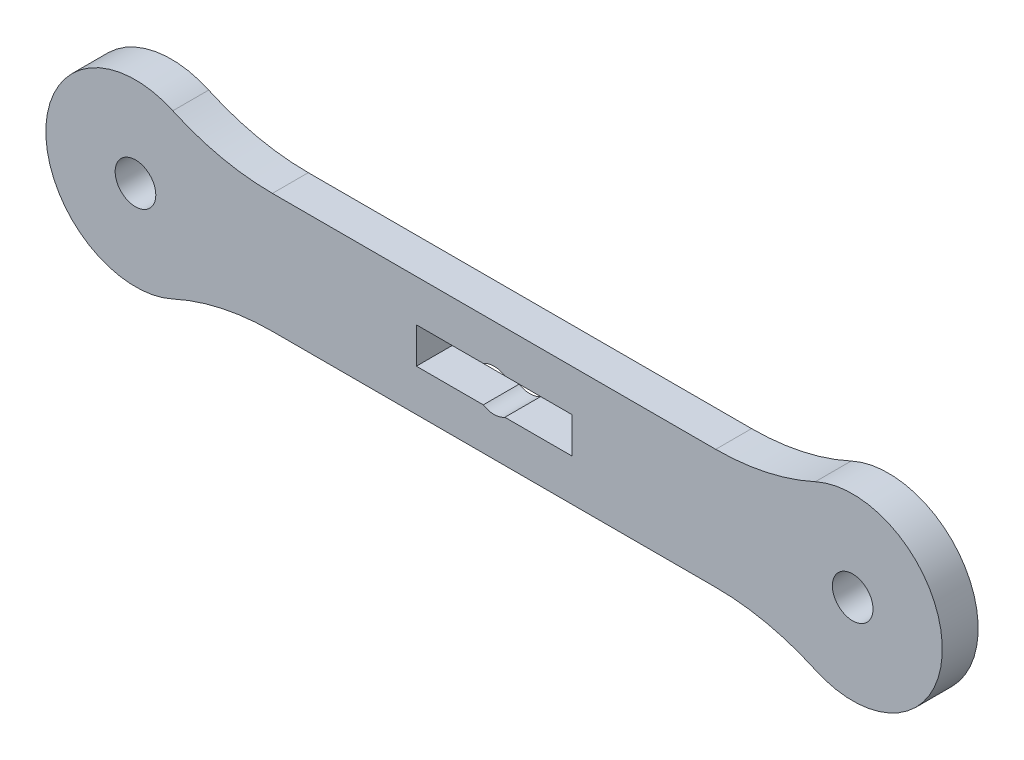
ISO-10303-21;
HEADER;
FILE_DESCRIPTION(('STEP AP214'),'2;1');
FILE_NAME('part.step','',(''),(''),'','','');
FILE_SCHEMA(('AUTOMOTIVE_DESIGN { 1 0 10303 214 1 1 1 1 }'));
ENDSEC;
DATA;
#1=APPLICATION_CONTEXT('core data for automotive mechanical design processes');
#2=APPLICATION_PROTOCOL_DEFINITION('international standard','automotive_design',2000,#1);
#3=PRODUCT_CONTEXT('',#1,'mechanical');
#4=PRODUCT('Part','Part','',(#3));
#5=PRODUCT_RELATED_PRODUCT_CATEGORY('part','',(#4));
#6=PRODUCT_DEFINITION_FORMATION('','',#4);
#7=PRODUCT_DEFINITION_CONTEXT('part definition',#1,'design');
#8=PRODUCT_DEFINITION('design','',#6,#7);
#9=PRODUCT_DEFINITION_SHAPE('','',#8);
#10=(LENGTH_UNIT() NAMED_UNIT(*) SI_UNIT(.MILLI.,.METRE.));
#11=(NAMED_UNIT(*) PLANE_ANGLE_UNIT() SI_UNIT($,.RADIAN.));
#12=(NAMED_UNIT(*) SI_UNIT($,.STERADIAN.) SOLID_ANGLE_UNIT());
#13=UNCERTAINTY_MEASURE_WITH_UNIT(LENGTH_MEASURE(1.E-05),#10,'distance_accuracy_value','');
#14=(GEOMETRIC_REPRESENTATION_CONTEXT(3) GLOBAL_UNCERTAINTY_ASSIGNED_CONTEXT((#13)) GLOBAL_UNIT_ASSIGNED_CONTEXT((#10,
#11,#12)) REPRESENTATION_CONTEXT('',''));
#15=CARTESIAN_POINT('',(0.,0.,0.));
#16=DIRECTION('',(0.,0.,1.));
#17=DIRECTION('',(1.,0.,0.));
#18=AXIS2_PLACEMENT_3D('',#15,#16,#17);
#19=CARTESIAN_POINT('',(30.,0.,3.));
#20=DIRECTION('',(0.,0.,-1.));
#21=DIRECTION('',(-1.,0.,0.));
#22=AXIS2_PLACEMENT_3D('',#19,#20,#21);
#23=CYLINDRICAL_SURFACE('',#22,1.75);
#24=CARTESIAN_POINT('',(30.,0.,0.));
#25=DIRECTION('',(0.,0.,1.));
#26=DIRECTION('',(1.,0.,0.));
#27=AXIS2_PLACEMENT_3D('',#24,#25,#26);
#28=CIRCLE('',#27,1.75);
#29=CARTESIAN_POINT('',(30.901387818866,1.50000000000001,0.));
#30=VERTEX_POINT('',#29);
#31=CARTESIAN_POINT('',(29.098612181134,1.50000000000001,0.));
#32=VERTEX_POINT('',#31);
#33=EDGE_CURVE('E154',#30,#32,#28,.T.);
#34=ORIENTED_EDGE('',*,*,#33,.F.);
#35=DIRECTION('',(0.,0.,-1.));
#36=VECTOR('',#35,1.);
#37=CARTESIAN_POINT('',(30.901387818866,1.50000000000001,3.));
#38=LINE('',#37,#36);
#39=CARTESIAN_POINT('',(30.901387818866,1.50000000000001,3.));
#40=VERTEX_POINT('',#39);
#41=EDGE_CURVE('E149',#40,#30,#38,.T.);
#42=ORIENTED_EDGE('',*,*,#41,.F.);
#43=CARTESIAN_POINT('',(30.,0.,3.));
#44=DIRECTION('',(0.,0.,1.));
#45=DIRECTION('',(1.,0.,0.));
#46=AXIS2_PLACEMENT_3D('',#43,#44,#45);
#47=CIRCLE('',#46,1.75);
#48=CARTESIAN_POINT('',(29.098612181134,1.50000000000001,3.));
#49=VERTEX_POINT('',#48);
#50=EDGE_CURVE('E152',#40,#49,#47,.T.);
#51=ORIENTED_EDGE('',*,*,#50,.T.);
#52=DIRECTION('',(0.,0.,-1.));
#53=VECTOR('',#52,1.);
#54=CARTESIAN_POINT('',(29.098612181134,1.50000000000001,3.));
#55=LINE('',#54,#53);
#56=EDGE_CURVE('E199',#49,#32,#55,.T.);
#57=ORIENTED_EDGE('',*,*,#56,.T.);
#58=EDGE_LOOP('',(#34,#42,#51,#57));
#59=FACE_BOUND('',#58,.T.);
#60=ADVANCED_FACE('F35',(#59),#23,.F.);
#61=CARTESIAN_POINT('',(0.,1.50000000000002,3.));
#62=DIRECTION('',(0.,1.,0.));
#63=DIRECTION('',(-1.,0.,0.));
#64=AXIS2_PLACEMENT_3D('',#61,#62,#63);
#65=PLANE('',#64);
#66=DIRECTION('',(1.,0.,0.));
#67=VECTOR('',#66,1.);
#68=CARTESIAN_POINT('',(0.,1.50000000000002,0.));
#69=LINE('',#68,#67);
#70=CARTESIAN_POINT('',(36.5,1.50000000000001,0.));
#71=VERTEX_POINT('',#70);
#72=EDGE_CURVE('E216',#30,#71,#69,.T.);
#73=ORIENTED_EDGE('',*,*,#72,.T.);
#74=DIRECTION('',(0.,0.,-1.));
#75=VECTOR('',#74,1.);
#76=CARTESIAN_POINT('',(36.5,1.50000000000001,3.));
#77=LINE('',#76,#75);
#78=CARTESIAN_POINT('',(36.5,1.50000000000001,3.));
#79=VERTEX_POINT('',#78);
#80=EDGE_CURVE('E159',#79,#71,#77,.T.);
#81=ORIENTED_EDGE('',*,*,#80,.F.);
#82=DIRECTION('',(1.,0.,0.));
#83=VECTOR('',#82,1.);
#84=CARTESIAN_POINT('',(0.,1.50000000000002,3.));
#85=LINE('',#84,#83);
#86=EDGE_CURVE('E163',#40,#79,#85,.T.);
#87=ORIENTED_EDGE('',*,*,#86,.F.);
#88=ORIENTED_EDGE('',*,*,#41,.T.);
#89=EDGE_LOOP('',(#73,#81,#87,#88));
#90=FACE_BOUND('',#89,.T.);
#91=ADVANCED_FACE('F164',(#90),#65,.F.);
#92=CARTESIAN_POINT('',(36.5,0.,3.));
#93=DIRECTION('',(1.,0.,0.));
#94=DIRECTION('',(0.,0.,-1.));
#95=AXIS2_PLACEMENT_3D('',#92,#93,#94);
#96=PLANE('',#95);
#97=DIRECTION('',(0.,-1.,0.));
#98=VECTOR('',#97,1.);
#99=CARTESIAN_POINT('',(36.5,0.,0.));
#100=LINE('',#99,#98);
#101=CARTESIAN_POINT('',(36.5,-1.49999999999999,0.));
#102=VERTEX_POINT('',#101);
#103=EDGE_CURVE('E218',#71,#102,#100,.T.);
#104=ORIENTED_EDGE('',*,*,#103,.T.);
#105=DIRECTION('',(0.,0.,-1.));
#106=VECTOR('',#105,1.);
#107=CARTESIAN_POINT('',(36.5,-1.49999999999999,3.));
#108=LINE('',#107,#106);
#109=CARTESIAN_POINT('',(36.5,-1.49999999999999,3.));
#110=VERTEX_POINT('',#109);
#111=EDGE_CURVE('E249',#110,#102,#108,.T.);
#112=ORIENTED_EDGE('',*,*,#111,.F.);
#113=DIRECTION('',(0.,-1.,0.));
#114=VECTOR('',#113,1.);
#115=CARTESIAN_POINT('',(36.5,0.,3.));
#116=LINE('',#115,#114);
#117=EDGE_CURVE('E167',#79,#110,#116,.T.);
#118=ORIENTED_EDGE('',*,*,#117,.F.);
#119=ORIENTED_EDGE('',*,*,#80,.T.);
#120=EDGE_LOOP('',(#104,#112,#118,#119));
#121=FACE_BOUND('',#120,.T.);
#122=ADVANCED_FACE('F334',(#121),#96,.F.);
#123=CARTESIAN_POINT('',(0.,-1.49999999999998,3.));
#124=DIRECTION('',(0.,1.,0.));
#125=DIRECTION('',(-1.,0.,0.));
#126=AXIS2_PLACEMENT_3D('',#123,#124,#125);
#127=PLANE('',#126);
#128=DIRECTION('',(1.,0.,0.));
#129=VECTOR('',#128,1.);
#130=CARTESIAN_POINT('',(0.,-1.49999999999998,0.));
#131=LINE('',#130,#129);
#132=CARTESIAN_POINT('',(30.901387818866,-1.49999999999999,0.));
#133=VERTEX_POINT('',#132);
#134=EDGE_CURVE('E221',#133,#102,#131,.T.);
#135=ORIENTED_EDGE('',*,*,#134,.F.);
#136=DIRECTION('',(0.,0.,-1.));
#137=VECTOR('',#136,1.);
#138=CARTESIAN_POINT('',(30.901387818866,-1.49999999999999,3.));
#139=LINE('',#138,#137);
#140=CARTESIAN_POINT('',(30.901387818866,-1.49999999999999,3.));
#141=VERTEX_POINT('',#140);
#142=EDGE_CURVE('E247',#141,#133,#139,.T.);
#143=ORIENTED_EDGE('',*,*,#142,.F.);
#144=DIRECTION('',(1.,0.,0.));
#145=VECTOR('',#144,1.);
#146=CARTESIAN_POINT('',(0.,-1.49999999999998,3.));
#147=LINE('',#146,#145);
#148=EDGE_CURVE('E183',#141,#110,#147,.T.);
#149=ORIENTED_EDGE('',*,*,#148,.T.);
#150=ORIENTED_EDGE('',*,*,#111,.T.);
#151=EDGE_LOOP('',(#135,#143,#149,#150));
#152=FACE_BOUND('',#151,.T.);
#153=ADVANCED_FACE('F369',(#152),#127,.T.);
#154=CARTESIAN_POINT('',(30.,0.,3.));
#155=DIRECTION('',(0.,0.,-1.));
#156=DIRECTION('',(-1.,0.,0.));
#157=AXIS2_PLACEMENT_3D('',#154,#155,#156);
#158=CYLINDRICAL_SURFACE('',#157,1.75);
#159=CARTESIAN_POINT('',(30.,0.,0.));
#160=DIRECTION('',(0.,0.,1.));
#161=DIRECTION('',(1.,0.,0.));
#162=AXIS2_PLACEMENT_3D('',#159,#160,#161);
#163=CIRCLE('',#162,1.75);
#164=CARTESIAN_POINT('',(29.098612181134,-1.49999999999999,0.));
#165=VERTEX_POINT('',#164);
#166=EDGE_CURVE('E224',#165,#133,#163,.T.);
#167=ORIENTED_EDGE('',*,*,#166,.F.);
#168=DIRECTION('',(0.,0.,-1.));
#169=VECTOR('',#168,1.);
#170=CARTESIAN_POINT('',(29.098612181134,-1.49999999999999,3.));
#171=LINE('',#170,#169);
#172=CARTESIAN_POINT('',(29.098612181134,-1.49999999999999,3.));
#173=VERTEX_POINT('',#172);
#174=EDGE_CURVE('E245',#173,#165,#171,.T.);
#175=ORIENTED_EDGE('',*,*,#174,.F.);
#176=CARTESIAN_POINT('',(30.,0.,3.));
#177=DIRECTION('',(0.,0.,1.));
#178=DIRECTION('',(1.,0.,0.));
#179=AXIS2_PLACEMENT_3D('',#176,#177,#178);
#180=CIRCLE('',#179,1.75);
#181=EDGE_CURVE('E186',#173,#141,#180,.T.);
#182=ORIENTED_EDGE('',*,*,#181,.T.);
#183=ORIENTED_EDGE('',*,*,#142,.T.);
#184=EDGE_LOOP('',(#167,#175,#182,#183));
#185=FACE_BOUND('',#184,.T.);
#186=ADVANCED_FACE('F360',(#185),#158,.F.);
#187=CARTESIAN_POINT('',(0.,-1.5,3.));
#188=DIRECTION('',(0.,1.,0.));
#189=DIRECTION('',(-1.,0.,0.));
#190=AXIS2_PLACEMENT_3D('',#187,#188,#189);
#191=PLANE('',#190);
#192=DIRECTION('',(1.,0.,0.));
#193=VECTOR('',#192,1.);
#194=CARTESIAN_POINT('',(0.,-1.5,0.));
#195=LINE('',#194,#193);
#196=CARTESIAN_POINT('',(23.5,-1.49999999999999,0.));
#197=VERTEX_POINT('',#196);
#198=EDGE_CURVE('E227',#197,#165,#195,.T.);
#199=ORIENTED_EDGE('',*,*,#198,.F.);
#200=DIRECTION('',(0.,0.,-1.));
#201=VECTOR('',#200,1.);
#202=CARTESIAN_POINT('',(23.5,-1.49999999999999,3.));
#203=LINE('',#202,#201);
#204=CARTESIAN_POINT('',(23.5,-1.49999999999999,3.));
#205=VERTEX_POINT('',#204);
#206=EDGE_CURVE('E243',#205,#197,#203,.T.);
#207=ORIENTED_EDGE('',*,*,#206,.F.);
#208=DIRECTION('',(1.,0.,0.));
#209=VECTOR('',#208,1.);
#210=CARTESIAN_POINT('',(0.,-1.5,3.));
#211=LINE('',#210,#209);
#212=EDGE_CURVE('E189',#205,#173,#211,.T.);
#213=ORIENTED_EDGE('',*,*,#212,.T.);
#214=ORIENTED_EDGE('',*,*,#174,.T.);
#215=EDGE_LOOP('',(#199,#207,#213,#214));
#216=FACE_BOUND('',#215,.T.);
#217=ADVANCED_FACE('F354',(#216),#191,.T.);
#218=CARTESIAN_POINT('',(23.5,0.,3.));
#219=DIRECTION('',(1.,0.,0.));
#220=DIRECTION('',(0.,0.,-1.));
#221=AXIS2_PLACEMENT_3D('',#218,#219,#220);
#222=PLANE('',#221);
#223=DIRECTION('',(0.,-1.,0.));
#224=VECTOR('',#223,1.);
#225=CARTESIAN_POINT('',(23.5,0.,0.));
#226=LINE('',#225,#224);
#227=CARTESIAN_POINT('',(23.5,1.50000000000001,0.));
#228=VERTEX_POINT('',#227);
#229=EDGE_CURVE('E230',#228,#197,#226,.T.);
#230=ORIENTED_EDGE('',*,*,#229,.F.);
#231=DIRECTION('',(0.,0.,-1.));
#232=VECTOR('',#231,1.);
#233=CARTESIAN_POINT('',(23.5,1.50000000000001,3.));
#234=LINE('',#233,#232);
#235=CARTESIAN_POINT('',(23.5,1.50000000000001,3.));
#236=VERTEX_POINT('',#235);
#237=EDGE_CURVE('E241',#236,#228,#234,.T.);
#238=ORIENTED_EDGE('',*,*,#237,.F.);
#239=DIRECTION('',(0.,-1.,0.));
#240=VECTOR('',#239,1.);
#241=CARTESIAN_POINT('',(23.5,0.,3.));
#242=LINE('',#241,#240);
#243=EDGE_CURVE('E192',#236,#205,#242,.T.);
#244=ORIENTED_EDGE('',*,*,#243,.T.);
#245=ORIENTED_EDGE('',*,*,#206,.T.);
#246=EDGE_LOOP('',(#230,#238,#244,#245));
#247=FACE_BOUND('',#246,.T.);
#248=ADVANCED_FACE('F350',(#247),#222,.T.);
#249=CARTESIAN_POINT('',(60.,0.,3.));
#250=DIRECTION('',(0.,0.,-1.));
#251=DIRECTION('',(-1.,0.,0.));
#252=AXIS2_PLACEMENT_3D('',#249,#250,#251);
#253=CYLINDRICAL_SURFACE('',#252,7.5);
#254=CARTESIAN_POINT('',(60.,0.,3.));
#255=DIRECTION('',(0.,0.,1.));
#256=DIRECTION('',(1.,0.,0.));
#257=AXIS2_PLACEMENT_3D('',#254,#255,#256);
#258=CIRCLE('',#257,7.5);
#259=CARTESIAN_POINT('',(56.875516571621,6.81818181818182,3.));
#260=VERTEX_POINT('',#259);
#261=CARTESIAN_POINT('',(56.875516571621,-6.81818181818181,3.));
#262=VERTEX_POINT('',#261);
#263=EDGE_CURVE('E239',#260,#262,#258,.F.);
#264=ORIENTED_EDGE('',*,*,#263,.T.);
#265=DIRECTION('',(0.,0.,-1.));
#266=VECTOR('',#265,1.);
#267=CARTESIAN_POINT('',(56.875516571621,-6.81818181818181,3.));
#268=LINE('',#267,#266);
#269=CARTESIAN_POINT('',(56.875516571621,-6.81818181818181,0.));
#270=VERTEX_POINT('',#269);
#271=EDGE_CURVE('E263',#262,#270,#268,.T.);
#272=ORIENTED_EDGE('',*,*,#271,.T.);
#273=CARTESIAN_POINT('',(60.,0.,0.));
#274=DIRECTION('',(0.,0.,1.));
#275=DIRECTION('',(1.,0.,0.));
#276=AXIS2_PLACEMENT_3D('',#273,#274,#275);
#277=CIRCLE('',#276,7.5);
#278=CARTESIAN_POINT('',(56.875516571621,6.81818181818182,0.));
#279=VERTEX_POINT('',#278);
#280=EDGE_CURVE('E200',#279,#270,#277,.F.);
#281=ORIENTED_EDGE('',*,*,#280,.F.);
#282=DIRECTION('',(0.,0.,-1.));
#283=VECTOR('',#282,1.);
#284=CARTESIAN_POINT('',(56.875516571621,6.81818181818182,3.));
#285=LINE('',#284,#283);
#286=EDGE_CURVE('E261',#279,#260,#285,.F.);
#287=ORIENTED_EDGE('',*,*,#286,.T.);
#288=EDGE_LOOP('',(#264,#272,#281,#287));
#289=FACE_BOUND('',#288,.T.);
#290=ADVANCED_FACE('F305',(#289),#253,.T.);
#291=CARTESIAN_POINT('',(0.,4.99999999999999,3.));
#292=DIRECTION('',(0.,1.,0.));
#293=DIRECTION('',(-1.,0.,0.));
#294=AXIS2_PLACEMENT_3D('',#291,#292,#293);
#295=PLANE('',#294);
#296=DIRECTION('',(1.,0.,0.));
#297=VECTOR('',#296,1.);
#298=CARTESIAN_POINT('',(0.,4.99999999999999,3.));
#299=LINE('',#298,#297);
#300=CARTESIAN_POINT('',(11.4564392373896,4.99999999999999,3.));
#301=VERTEX_POINT('',#300);
#302=CARTESIAN_POINT('',(48.5435607626104,5.,3.));
#303=VERTEX_POINT('',#302);
#304=EDGE_CURVE('E294',#301,#303,#299,.T.);
#305=ORIENTED_EDGE('',*,*,#304,.T.);
#306=DIRECTION('',(0.,0.,1.));
#307=VECTOR('',#306,1.);
#308=CARTESIAN_POINT('',(48.5435607626104,5.,0.));
#309=LINE('',#308,#307);
#310=CARTESIAN_POINT('',(48.5435607626104,5.,0.));
#311=VERTEX_POINT('',#310);
#312=EDGE_CURVE('E267',#303,#311,#309,.F.);
#313=ORIENTED_EDGE('',*,*,#312,.T.);
#314=DIRECTION('',(1.,0.,0.));
#315=VECTOR('',#314,1.);
#316=CARTESIAN_POINT('',(0.,4.99999999999999,0.));
#317=LINE('',#316,#315);
#318=CARTESIAN_POINT('',(11.4564392373896,4.99999999999999,0.));
#319=VERTEX_POINT('',#318);
#320=EDGE_CURVE('E203',#319,#311,#317,.T.);
#321=ORIENTED_EDGE('',*,*,#320,.F.);
#322=DIRECTION('',(0.,0.,-1.));
#323=VECTOR('',#322,1.);
#324=CARTESIAN_POINT('',(11.4564392373896,4.99999999999999,3.));
#325=LINE('',#324,#323);
#326=EDGE_CURVE('E57',#319,#301,#325,.F.);
#327=ORIENTED_EDGE('',*,*,#326,.T.);
#328=EDGE_LOOP('',(#305,#313,#321,#327));
#329=FACE_BOUND('',#328,.T.);
#330=ADVANCED_FACE('F286',(#329),#295,.T.);
#331=CARTESIAN_POINT('',(0.,0.,3.));
#332=DIRECTION('',(0.,0.,-1.));
#333=DIRECTION('',(-1.,0.,0.));
#334=AXIS2_PLACEMENT_3D('',#331,#332,#333);
#335=CYLINDRICAL_SURFACE('',#334,7.5);
#336=CARTESIAN_POINT('',(0.,0.,0.));
#337=DIRECTION('',(0.,0.,1.));
#338=DIRECTION('',(1.,0.,0.));
#339=AXIS2_PLACEMENT_3D('',#336,#337,#338);
#340=CIRCLE('',#339,7.5);
#341=CARTESIAN_POINT('',(3.12448342837898,6.81818181818182,0.));
#342=VERTEX_POINT('',#341);
#343=CARTESIAN_POINT('',(3.12448342837898,-6.81818181818182,0.));
#344=VERTEX_POINT('',#343);
#345=EDGE_CURVE('E206',#342,#344,#340,.T.);
#346=ORIENTED_EDGE('',*,*,#345,.T.);
#347=DIRECTION('',(0.,0.,-1.));
#348=VECTOR('',#347,1.);
#349=CARTESIAN_POINT('',(3.12448342837898,-6.81818181818182,3.));
#350=LINE('',#349,#348);
#351=CARTESIAN_POINT('',(3.12448342837898,-6.81818181818182,3.));
#352=VERTEX_POINT('',#351);
#353=EDGE_CURVE('E259',#344,#352,#350,.F.);
#354=ORIENTED_EDGE('',*,*,#353,.T.);
#355=CARTESIAN_POINT('',(0.,0.,3.));
#356=DIRECTION('',(0.,0.,1.));
#357=DIRECTION('',(1.,0.,0.));
#358=AXIS2_PLACEMENT_3D('',#355,#356,#357);
#359=CIRCLE('',#358,7.5);
#360=CARTESIAN_POINT('',(3.12448342837898,6.81818181818182,3.));
#361=VERTEX_POINT('',#360);
#362=EDGE_CURVE('E292',#361,#352,#359,.T.);
#363=ORIENTED_EDGE('',*,*,#362,.F.);
#364=DIRECTION('',(0.,0.,-1.));
#365=VECTOR('',#364,1.);
#366=CARTESIAN_POINT('',(3.12448342837898,6.81818181818182,3.));
#367=LINE('',#366,#365);
#368=EDGE_CURVE('E256',#361,#342,#367,.T.);
#369=ORIENTED_EDGE('',*,*,#368,.T.);
#370=EDGE_LOOP('',(#346,#354,#363,#369));
#371=FACE_BOUND('',#370,.T.);
#372=ADVANCED_FACE('F296',(#371),#335,.T.);
#373=CARTESIAN_POINT('',(0.,1.5,3.));
#374=DIRECTION('',(0.,1.,0.));
#375=DIRECTION('',(-1.,0.,0.));
#376=AXIS2_PLACEMENT_3D('',#373,#374,#375);
#377=PLANE('',#376);
#378=DIRECTION('',(1.,0.,0.));
#379=VECTOR('',#378,1.);
#380=CARTESIAN_POINT('',(0.,1.5,0.));
#381=LINE('',#380,#379);
#382=EDGE_CURVE('E233',#228,#32,#381,.T.);
#383=ORIENTED_EDGE('',*,*,#382,.T.);
#384=ORIENTED_EDGE('',*,*,#56,.F.);
#385=DIRECTION('',(1.,0.,0.));
#386=VECTOR('',#385,1.);
#387=CARTESIAN_POINT('',(0.,1.5,3.));
#388=LINE('',#387,#386);
#389=EDGE_CURVE('E173',#236,#49,#388,.T.);
#390=ORIENTED_EDGE('',*,*,#389,.F.);
#391=ORIENTED_EDGE('',*,*,#237,.T.);
#392=EDGE_LOOP('',(#383,#384,#390,#391));
#393=FACE_BOUND('',#392,.T.);
#394=ADVANCED_FACE('F341',(#393),#377,.F.);
#395=CARTESIAN_POINT('',(0.,0.,3.));
#396=DIRECTION('',(0.,0.,-1.));
#397=DIRECTION('',(-1.,0.,0.));
#398=AXIS2_PLACEMENT_3D('',#395,#396,#397);
#399=CYLINDRICAL_SURFACE('',#398,1.7);
#400=CARTESIAN_POINT('',(0.,0.,3.));
#401=DIRECTION('',(0.,0.,1.));
#402=DIRECTION('',(1.,0.,0.));
#403=AXIS2_PLACEMENT_3D('',#400,#401,#402);
#404=CIRCLE('',#403,1.7);
#405=CARTESIAN_POINT('',(1.7,0.,3.));
#406=VERTEX_POINT('',#405);
#407=EDGE_CURVE('E175',#406,#406,#404,.T.);
#408=ORIENTED_EDGE('',*,*,#407,.T.);
#409=EDGE_LOOP('',(#408));
#410=FACE_BOUND('',#409,.T.);
#411=CARTESIAN_POINT('',(0.,0.,0.));
#412=DIRECTION('',(0.,0.,1.));
#413=DIRECTION('',(1.,0.,0.));
#414=AXIS2_PLACEMENT_3D('',#411,#412,#413);
#415=CIRCLE('',#414,1.7);
#416=CARTESIAN_POINT('',(1.7,0.,0.));
#417=VERTEX_POINT('',#416);
#418=EDGE_CURVE('E212',#417,#417,#415,.T.);
#419=ORIENTED_EDGE('',*,*,#418,.F.);
#420=EDGE_LOOP('',(#419));
#421=FACE_BOUND('',#420,.T.);
#422=ADVANCED_FACE('F338',(#410,#421),#399,.F.);
#423=CARTESIAN_POINT('',(0.,-5.00000000000001,3.));
#424=DIRECTION('',(0.,1.,0.));
#425=DIRECTION('',(-1.,0.,0.));
#426=AXIS2_PLACEMENT_3D('',#423,#424,#425);
#427=PLANE('',#426);
#428=DIRECTION('',(1.,0.,0.));
#429=VECTOR('',#428,1.);
#430=CARTESIAN_POINT('',(0.,-5.00000000000001,3.));
#431=LINE('',#430,#429);
#432=CARTESIAN_POINT('',(11.4564392373896,-5.00000000000001,3.));
#433=VERTEX_POINT('',#432);
#434=CARTESIAN_POINT('',(48.5435607626104,-5.,3.));
#435=VERTEX_POINT('',#434);
#436=EDGE_CURVE('E178',#433,#435,#431,.T.);
#437=ORIENTED_EDGE('',*,*,#436,.F.);
#438=DIRECTION('',(0.,0.,1.));
#439=VECTOR('',#438,1.);
#440=CARTESIAN_POINT('',(11.4564392373896,-5.00000000000001,0.));
#441=LINE('',#440,#439);
#442=CARTESIAN_POINT('',(11.4564392373896,-5.00000000000001,0.));
#443=VERTEX_POINT('',#442);
#444=EDGE_CURVE('E253',#433,#443,#441,.F.);
#445=ORIENTED_EDGE('',*,*,#444,.T.);
#446=DIRECTION('',(1.,0.,0.));
#447=VECTOR('',#446,1.);
#448=CARTESIAN_POINT('',(0.,-5.00000000000001,0.));
#449=LINE('',#448,#447);
#450=CARTESIAN_POINT('',(48.5435607626104,-5.,0.));
#451=VERTEX_POINT('',#450);
#452=EDGE_CURVE('E209',#443,#451,#449,.T.);
#453=ORIENTED_EDGE('',*,*,#452,.T.);
#454=DIRECTION('',(0.,0.,-1.));
#455=VECTOR('',#454,1.);
#456=CARTESIAN_POINT('',(48.5435607626104,-5.,3.));
#457=LINE('',#456,#455);
#458=EDGE_CURVE('E158',#451,#435,#457,.F.);
#459=ORIENTED_EDGE('',*,*,#458,.T.);
#460=EDGE_LOOP('',(#437,#445,#453,#459));
#461=FACE_BOUND('',#460,.T.);
#462=ADVANCED_FACE('F315',(#461),#427,.F.);
#463=CARTESIAN_POINT('',(60.,0.,3.));
#464=DIRECTION('',(0.,0.,-1.));
#465=DIRECTION('',(-1.,0.,0.));
#466=AXIS2_PLACEMENT_3D('',#463,#464,#465);
#467=CYLINDRICAL_SURFACE('',#466,1.7);
#468=CARTESIAN_POINT('',(60.,0.,3.));
#469=DIRECTION('',(0.,0.,1.));
#470=DIRECTION('',(1.,0.,0.));
#471=AXIS2_PLACEMENT_3D('',#468,#469,#470);
#472=CIRCLE('',#471,1.7);
#473=CARTESIAN_POINT('',(61.7,0.,3.));
#474=VERTEX_POINT('',#473);
#475=EDGE_CURVE('E196',#474,#474,#472,.F.);
#476=ORIENTED_EDGE('',*,*,#475,.F.);
#477=EDGE_LOOP('',(#476));
#478=FACE_BOUND('',#477,.T.);
#479=CARTESIAN_POINT('',(60.,0.,0.));
#480=DIRECTION('',(0.,0.,1.));
#481=DIRECTION('',(1.,0.,0.));
#482=AXIS2_PLACEMENT_3D('',#479,#480,#481);
#483=CIRCLE('',#482,1.7);
#484=CARTESIAN_POINT('',(61.7,0.,0.));
#485=VERTEX_POINT('',#484);
#486=EDGE_CURVE('E236',#485,#485,#483,.F.);
#487=ORIENTED_EDGE('',*,*,#486,.T.);
#488=EDGE_LOOP('',(#487));
#489=FACE_BOUND('',#488,.T.);
#490=ADVANCED_FACE('F345',(#478,#489),#467,.F.);
#491=CARTESIAN_POINT('',(0.,0.,3.));
#492=DIRECTION('',(0.,0.,1.));
#493=DIRECTION('',(1.,0.,0.));
#494=AXIS2_PLACEMENT_3D('',#491,#492,#493);
#495=PLANE('',#494);
#496=ORIENTED_EDGE('',*,*,#263,.F.);
#497=CARTESIAN_POINT('',(48.5435607626104,25.,3.));
#498=DIRECTION('',(0.,0.,1.));
#499=DIRECTION('',(1.,0.,0.));
#500=AXIS2_PLACEMENT_3D('',#497,#498,#499);
#501=CIRCLE('',#500,20.);
#502=EDGE_CURVE('E50',#260,#303,#501,.F.);
#503=ORIENTED_EDGE('',*,*,#502,.T.);
#504=ORIENTED_EDGE('',*,*,#304,.F.);
#505=CARTESIAN_POINT('',(11.4564392373896,25.,3.));
#506=DIRECTION('',(0.,0.,1.));
#507=DIRECTION('',(1.,0.,0.));
#508=AXIS2_PLACEMENT_3D('',#505,#506,#507);
#509=CIRCLE('',#508,20.);
#510=EDGE_CURVE('E11',#301,#361,#509,.F.);
#511=ORIENTED_EDGE('',*,*,#510,.T.);
#512=ORIENTED_EDGE('',*,*,#362,.T.);
#513=CARTESIAN_POINT('',(11.4564392373896,-25.,3.));
#514=DIRECTION('',(0.,0.,1.));
#515=DIRECTION('',(1.,0.,0.));
#516=AXIS2_PLACEMENT_3D('',#513,#514,#515);
#517=CIRCLE('',#516,20.);
#518=EDGE_CURVE('E272',#352,#433,#517,.F.);
#519=ORIENTED_EDGE('',*,*,#518,.T.);
#520=ORIENTED_EDGE('',*,*,#436,.T.);
#521=CARTESIAN_POINT('',(48.5435607626104,-25.,3.));
#522=DIRECTION('',(0.,0.,1.));
#523=DIRECTION('',(1.,0.,0.));
#524=AXIS2_PLACEMENT_3D('',#521,#522,#523);
#525=CIRCLE('',#524,20.);
#526=EDGE_CURVE('E276',#435,#262,#525,.F.);
#527=ORIENTED_EDGE('',*,*,#526,.T.);
#528=EDGE_LOOP('',(#496,#503,#504,#511,#512,#519,#520,#527));
#529=FACE_BOUND('',#528,.T.);
#530=ORIENTED_EDGE('',*,*,#407,.F.);
#531=EDGE_LOOP('',(#530));
#532=FACE_BOUND('',#531,.T.);
#533=ORIENTED_EDGE('',*,*,#50,.F.);
#534=ORIENTED_EDGE('',*,*,#86,.T.);
#535=ORIENTED_EDGE('',*,*,#117,.T.);
#536=ORIENTED_EDGE('',*,*,#148,.F.);
#537=ORIENTED_EDGE('',*,*,#181,.F.);
#538=ORIENTED_EDGE('',*,*,#212,.F.);
#539=ORIENTED_EDGE('',*,*,#243,.F.);
#540=ORIENTED_EDGE('',*,*,#389,.T.);
#541=EDGE_LOOP('',(#533,#534,#535,#536,#537,#538,#539,#540));
#542=FACE_BOUND('',#541,.T.);
#543=ORIENTED_EDGE('',*,*,#475,.T.);
#544=EDGE_LOOP('',(#543));
#545=FACE_BOUND('',#544,.T.);
#546=ADVANCED_FACE('F169',(#529,#532,#542,#545),#495,.T.);
#547=CARTESIAN_POINT('',(0.,0.,0.));
#548=DIRECTION('',(0.,0.,1.));
#549=DIRECTION('',(1.,0.,0.));
#550=AXIS2_PLACEMENT_3D('',#547,#548,#549);
#551=PLANE('',#550);
#552=ORIENTED_EDGE('',*,*,#320,.T.);
#553=CARTESIAN_POINT('',(48.5435607626104,25.,0.));
#554=DIRECTION('',(0.,0.,1.));
#555=DIRECTION('',(1.,0.,0.));
#556=AXIS2_PLACEMENT_3D('',#553,#554,#555);
#557=CIRCLE('',#556,20.);
#558=EDGE_CURVE('E278',#311,#279,#557,.T.);
#559=ORIENTED_EDGE('',*,*,#558,.T.);
#560=ORIENTED_EDGE('',*,*,#280,.T.);
#561=CARTESIAN_POINT('',(48.5435607626104,-25.,0.));
#562=DIRECTION('',(0.,0.,1.));
#563=DIRECTION('',(1.,0.,0.));
#564=AXIS2_PLACEMENT_3D('',#561,#562,#563);
#565=CIRCLE('',#564,20.);
#566=EDGE_CURVE('E274',#270,#451,#565,.T.);
#567=ORIENTED_EDGE('',*,*,#566,.T.);
#568=ORIENTED_EDGE('',*,*,#452,.F.);
#569=CARTESIAN_POINT('',(11.4564392373896,-25.,0.));
#570=DIRECTION('',(0.,0.,1.));
#571=DIRECTION('',(1.,0.,0.));
#572=AXIS2_PLACEMENT_3D('',#569,#570,#571);
#573=CIRCLE('',#572,20.);
#574=EDGE_CURVE('E270',#443,#344,#573,.T.);
#575=ORIENTED_EDGE('',*,*,#574,.T.);
#576=ORIENTED_EDGE('',*,*,#345,.F.);
#577=CARTESIAN_POINT('',(11.4564392373896,25.,0.));
#578=DIRECTION('',(0.,0.,1.));
#579=DIRECTION('',(1.,0.,0.));
#580=AXIS2_PLACEMENT_3D('',#577,#578,#579);
#581=CIRCLE('',#580,20.);
#582=EDGE_CURVE('E43',#342,#319,#581,.T.);
#583=ORIENTED_EDGE('',*,*,#582,.T.);
#584=EDGE_LOOP('',(#552,#559,#560,#567,#568,#575,#576,#583));
#585=FACE_BOUND('',#584,.T.);
#586=ORIENTED_EDGE('',*,*,#418,.T.);
#587=EDGE_LOOP('',(#586));
#588=FACE_BOUND('',#587,.T.);
#589=ORIENTED_EDGE('',*,*,#33,.T.);
#590=ORIENTED_EDGE('',*,*,#382,.F.);
#591=ORIENTED_EDGE('',*,*,#229,.T.);
#592=ORIENTED_EDGE('',*,*,#198,.T.);
#593=ORIENTED_EDGE('',*,*,#166,.T.);
#594=ORIENTED_EDGE('',*,*,#134,.T.);
#595=ORIENTED_EDGE('',*,*,#103,.F.);
#596=ORIENTED_EDGE('',*,*,#72,.F.);
#597=EDGE_LOOP('',(#589,#590,#591,#592,#593,#594,#595,#596));
#598=FACE_BOUND('',#597,.T.);
#599=ORIENTED_EDGE('',*,*,#486,.F.);
#600=EDGE_LOOP('',(#599));
#601=FACE_BOUND('',#600,.T.);
#602=ADVANCED_FACE('F282',(#585,#588,#598,#601),#551,.F.);
#603=CARTESIAN_POINT('',(11.4564392373896,-25.,3.));
#604=DIRECTION('',(0.,0.,-1.));
#605=DIRECTION('',(-1.,0.,0.));
#606=AXIS2_PLACEMENT_3D('',#603,#604,#605);
#607=CYLINDRICAL_SURFACE('',#606,20.);
#608=ORIENTED_EDGE('',*,*,#518,.F.);
#609=ORIENTED_EDGE('',*,*,#353,.F.);
#610=ORIENTED_EDGE('',*,*,#574,.F.);
#611=ORIENTED_EDGE('',*,*,#444,.F.);
#612=EDGE_LOOP('',(#608,#609,#610,#611));
#613=FACE_BOUND('',#612,.T.);
#614=ADVANCED_FACE('F318',(#613),#607,.F.);
#615=CARTESIAN_POINT('',(48.5435607626104,-25.,3.));
#616=DIRECTION('',(0.,0.,-1.));
#617=DIRECTION('',(-1.,0.,0.));
#618=AXIS2_PLACEMENT_3D('',#615,#616,#617);
#619=CYLINDRICAL_SURFACE('',#618,20.);
#620=ORIENTED_EDGE('',*,*,#526,.F.);
#621=ORIENTED_EDGE('',*,*,#458,.F.);
#622=ORIENTED_EDGE('',*,*,#566,.F.);
#623=ORIENTED_EDGE('',*,*,#271,.F.);
#624=EDGE_LOOP('',(#620,#621,#622,#623));
#625=FACE_BOUND('',#624,.T.);
#626=ADVANCED_FACE('F310',(#625),#619,.F.);
#627=CARTESIAN_POINT('',(48.5435607626104,25.,3.));
#628=DIRECTION('',(0.,0.,-1.));
#629=DIRECTION('',(-1.,0.,0.));
#630=AXIS2_PLACEMENT_3D('',#627,#628,#629);
#631=CYLINDRICAL_SURFACE('',#630,20.);
#632=ORIENTED_EDGE('',*,*,#502,.F.);
#633=ORIENTED_EDGE('',*,*,#286,.F.);
#634=ORIENTED_EDGE('',*,*,#558,.F.);
#635=ORIENTED_EDGE('',*,*,#312,.F.);
#636=EDGE_LOOP('',(#632,#633,#634,#635));
#637=FACE_BOUND('',#636,.T.);
#638=ADVANCED_FACE('F325',(#637),#631,.F.);
#639=CARTESIAN_POINT('',(11.4564392373896,25.,3.));
#640=DIRECTION('',(0.,0.,-1.));
#641=DIRECTION('',(-1.,0.,0.));
#642=AXIS2_PLACEMENT_3D('',#639,#640,#641);
#643=CYLINDRICAL_SURFACE('',#642,20.);
#644=ORIENTED_EDGE('',*,*,#510,.F.);
#645=ORIENTED_EDGE('',*,*,#326,.F.);
#646=ORIENTED_EDGE('',*,*,#582,.F.);
#647=ORIENTED_EDGE('',*,*,#368,.F.);
#648=EDGE_LOOP('',(#644,#645,#646,#647));
#649=FACE_BOUND('',#648,.T.);
#650=ADVANCED_FACE('F37',(#649),#643,.F.);
#651=CLOSED_SHELL('',(#60,#91,#122,#153,#186,#217,#248,#290,#330,#372,#394,#422,#462,#490,#546,
#602,#614,#626,#638,#650));
#652=MANIFOLD_SOLID_BREP('B2',#651);
#653=ADVANCED_BREP_SHAPE_REPRESENTATION('',(#18,#652),#14);
#654=SHAPE_DEFINITION_REPRESENTATION(#9,#653);
ENDSEC;
END-ISO-10303-21;
